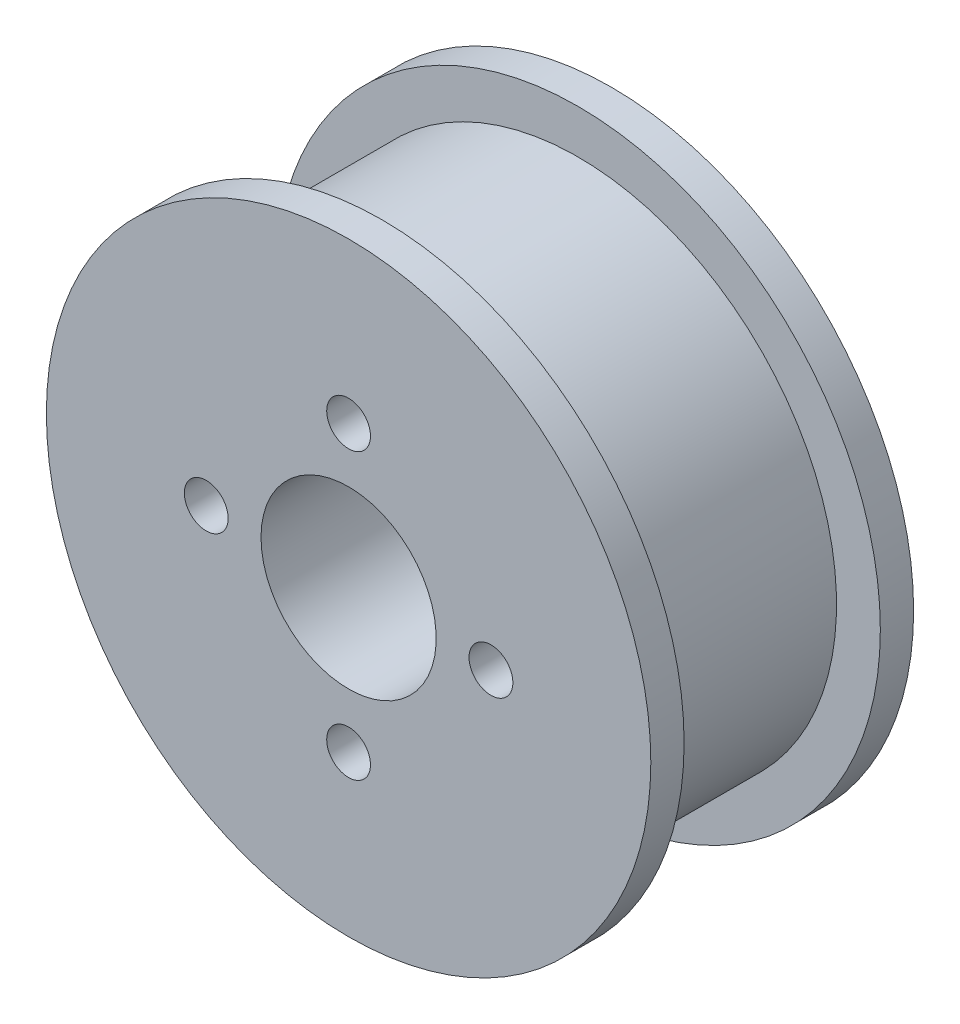
ISO-10303-21;
HEADER;
FILE_DESCRIPTION(('STEP AP214'),'2;1');
FILE_NAME('part.step','',(''),(''),'','','');
FILE_SCHEMA(('AUTOMOTIVE_DESIGN { 1 0 10303 214 1 1 1 1 }'));
ENDSEC;
DATA;
#1=APPLICATION_CONTEXT('core data for automotive mechanical design processes');
#2=APPLICATION_PROTOCOL_DEFINITION('international standard','automotive_design',2000,#1);
#3=PRODUCT_CONTEXT('',#1,'mechanical');
#4=PRODUCT('Part','Part','',(#3));
#5=PRODUCT_RELATED_PRODUCT_CATEGORY('part','',(#4));
#6=PRODUCT_DEFINITION_FORMATION('','',#4);
#7=PRODUCT_DEFINITION_CONTEXT('part definition',#1,'design');
#8=PRODUCT_DEFINITION('design','',#6,#7);
#9=PRODUCT_DEFINITION_SHAPE('','',#8);
#10=(LENGTH_UNIT() NAMED_UNIT(*) SI_UNIT(.MILLI.,.METRE.));
#11=(NAMED_UNIT(*) PLANE_ANGLE_UNIT() SI_UNIT($,.RADIAN.));
#12=(NAMED_UNIT(*) SI_UNIT($,.STERADIAN.) SOLID_ANGLE_UNIT());
#13=UNCERTAINTY_MEASURE_WITH_UNIT(LENGTH_MEASURE(1.E-05),#10,'distance_accuracy_value','');
#14=(GEOMETRIC_REPRESENTATION_CONTEXT(3) GLOBAL_UNCERTAINTY_ASSIGNED_CONTEXT((#13)) GLOBAL_UNIT_ASSIGNED_CONTEXT((#10,
#11,#12)) REPRESENTATION_CONTEXT('',''));
#15=CARTESIAN_POINT('',(0.,0.,0.));
#16=DIRECTION('',(0.,0.,1.));
#17=DIRECTION('',(1.,0.,0.));
#18=AXIS2_PLACEMENT_3D('',#15,#16,#17);
#19=CARTESIAN_POINT('',(0.,0.,1.9));
#20=DIRECTION('',(0.,0.,-1.));
#21=DIRECTION('',(-1.,0.,0.));
#22=AXIS2_PLACEMENT_3D('',#19,#20,#21);
#23=CYLINDRICAL_SURFACE('',#22,17.25);
#24=CARTESIAN_POINT('',(0.,0.,1.9));
#25=DIRECTION('',(0.,0.,1.));
#26=DIRECTION('',(1.,0.,0.));
#27=AXIS2_PLACEMENT_3D('',#24,#25,#26);
#28=CIRCLE('',#27,17.25);
#29=CARTESIAN_POINT('',(-17.25,0.,1.9));
#30=VERTEX_POINT('',#29);
#31=EDGE_CURVE('E43',#30,#30,#28,.T.);
#32=CARTESIAN_POINT('',(0.,0.,0.));
#33=DIRECTION('',(0.,0.,1.));
#34=DIRECTION('',(1.,0.,0.));
#35=AXIS2_PLACEMENT_3D('',#32,#33,#34);
#36=CIRCLE('',#35,17.25);
#37=CARTESIAN_POINT('',(-17.25,0.,0.));
#38=VERTEX_POINT('',#37);
#39=EDGE_CURVE('E39',#38,#38,#36,.T.);
#40=CARTESIAN_POINT('',(-17.25,0.,1.9));
#41=CARTESIAN_POINT('',(-17.25,0.,1.88020833333333));
#42=CARTESIAN_POINT('',(-17.25,0.,1.86041666666667));
#43=CARTESIAN_POINT('',(-17.25,0.,1.82083333333333));
#44=CARTESIAN_POINT('',(-17.25,0.,1.80104166666667));
#45=CARTESIAN_POINT('',(-17.25,0.,1.76145833333333));
#46=CARTESIAN_POINT('',(-17.25,0.,1.74166666666667));
#47=CARTESIAN_POINT('',(-17.25,0.,1.70208333333333));
#48=CARTESIAN_POINT('',(-17.25,0.,1.68229166666667));
#49=CARTESIAN_POINT('',(-17.25,0.,1.64270833333333));
#50=CARTESIAN_POINT('',(-17.25,0.,1.62291666666667));
#51=CARTESIAN_POINT('',(-17.25,0.,1.58333333333333));
#52=CARTESIAN_POINT('',(-17.25,0.,1.56354166666667));
#53=CARTESIAN_POINT('',(-17.25,0.,1.52395833333333));
#54=CARTESIAN_POINT('',(-17.25,0.,1.50416666666667));
#55=CARTESIAN_POINT('',(-17.25,0.,1.46458333333333));
#56=CARTESIAN_POINT('',(-17.25,0.,1.44479166666667));
#57=CARTESIAN_POINT('',(-17.25,0.,1.40520833333333));
#58=CARTESIAN_POINT('',(-17.25,0.,1.38541666666667));
#59=CARTESIAN_POINT('',(-17.25,0.,1.34583333333333));
#60=CARTESIAN_POINT('',(-17.25,0.,1.32604166666667));
#61=CARTESIAN_POINT('',(-17.25,0.,1.28645833333333));
#62=CARTESIAN_POINT('',(-17.25,0.,1.26666666666667));
#63=CARTESIAN_POINT('',(-17.25,0.,1.22708333333333));
#64=CARTESIAN_POINT('',(-17.25,0.,1.20729166666667));
#65=CARTESIAN_POINT('',(-17.25,0.,1.16770833333333));
#66=CARTESIAN_POINT('',(-17.25,0.,1.14791666666667));
#67=CARTESIAN_POINT('',(-17.25,0.,1.10833333333333));
#68=CARTESIAN_POINT('',(-17.25,0.,1.08854166666667));
#69=CARTESIAN_POINT('',(-17.25,0.,1.04895833333333));
#70=CARTESIAN_POINT('',(-17.25,0.,1.02916666666667));
#71=CARTESIAN_POINT('',(-17.25,0.,0.989583333333333));
#72=CARTESIAN_POINT('',(-17.25,0.,0.969791666666666));
#73=CARTESIAN_POINT('',(-17.25,0.,0.930208333333333));
#74=CARTESIAN_POINT('',(-17.25,0.,0.910416666666667));
#75=CARTESIAN_POINT('',(-17.25,0.,0.870833333333333));
#76=CARTESIAN_POINT('',(-17.25,0.,0.851041666666667));
#77=CARTESIAN_POINT('',(-17.25,0.,0.811458333333333));
#78=CARTESIAN_POINT('',(-17.25,0.,0.791666666666667));
#79=CARTESIAN_POINT('',(-17.25,0.,0.752083333333333));
#80=CARTESIAN_POINT('',(-17.25,0.,0.732291666666667));
#81=CARTESIAN_POINT('',(-17.25,0.,0.692708333333333));
#82=CARTESIAN_POINT('',(-17.25,0.,0.672916666666667));
#83=CARTESIAN_POINT('',(-17.25,0.,0.633333333333333));
#84=CARTESIAN_POINT('',(-17.25,0.,0.613541666666667));
#85=CARTESIAN_POINT('',(-17.25,0.,0.573958333333333));
#86=CARTESIAN_POINT('',(-17.25,0.,0.554166666666667));
#87=CARTESIAN_POINT('',(-17.25,0.,0.514583333333334));
#88=CARTESIAN_POINT('',(-17.25,0.,0.494791666666667));
#89=CARTESIAN_POINT('',(-17.25,0.,0.455208333333333));
#90=CARTESIAN_POINT('',(-17.25,0.,0.435416666666667));
#91=CARTESIAN_POINT('',(-17.25,0.,0.395833333333333));
#92=CARTESIAN_POINT('',(-17.25,0.,0.376041666666667));
#93=CARTESIAN_POINT('',(-17.25,0.,0.336458333333333));
#94=CARTESIAN_POINT('',(-17.25,0.,0.316666666666667));
#95=CARTESIAN_POINT('',(-17.25,0.,0.277083333333333));
#96=CARTESIAN_POINT('',(-17.25,0.,0.257291666666667));
#97=CARTESIAN_POINT('',(-17.25,0.,0.217708333333333));
#98=CARTESIAN_POINT('',(-17.25,0.,0.197916666666667));
#99=CARTESIAN_POINT('',(-17.25,0.,0.158333333333333));
#100=CARTESIAN_POINT('',(-17.25,0.,0.138541666666667));
#101=CARTESIAN_POINT('',(-17.25,0.,0.0989583333333333));
#102=CARTESIAN_POINT('',(-17.25,0.,0.0791666666666666));
#103=CARTESIAN_POINT('',(-17.25,0.,0.0395833333333333));
#104=CARTESIAN_POINT('',(-17.25,0.,0.0197916666666666));
#105=CARTESIAN_POINT('',(-17.25,0.,0.));
#106=B_SPLINE_CURVE_WITH_KNOTS('',3,(#40,#41,#42,#43,#44,#45,#46,#47,#48,#49,#50,#51,#52,#53,
#54,#55,#56,#57,#58,#59,#60,#61,#62,#63,#64,#65,#66,#67,#68,#69,#70,#71,#72,#73,#74,#75,#76,#77,
#78,#79,#80,#81,#82,#83,#84,#85,#86,#87,#88,#89,#90,#91,#92,#93,#94,#95,#96,#97,#98,#99,#100,
#101,#102,#103,#104,#105),.UNSPECIFIED.,.F.,.F.,(4,2,2,2,2,2,2,2,2,2,2,2,2,2,2,2,2,2,2,2,2,2,2,
2,2,2,2,2,2,2,2,2,4),(0.,0.0593750000000002,0.11875,0.178125,0.2375,0.296875,0.35625,0.415625,
0.475,0.534375,0.59375,0.653125,0.7125,0.771875,0.83125,0.890625,0.95,1.009375,1.06875,1.128125,
1.1875,1.246875,1.30625,1.365625,1.425,1.484375,1.54375,1.603125,1.6625,1.721875,1.78125,
1.840625,1.9),.UNSPECIFIED.);
#107=EDGE_CURVE('BSEAM36',#30,#38,#106,.T.);
#108=ORIENTED_EDGE('',*,*,#31,.F.);
#109=ORIENTED_EDGE('',*,*,#39,.T.);
#110=ORIENTED_EDGE('',*,*,#107,.T.);
#111=ORIENTED_EDGE('',*,*,#107,.F.);
#112=EDGE_LOOP('',(#108,#110,#109,#111));
#113=FACE_BOUND('',#112,.T.);
#114=ADVANCED_FACE('F36',(#113),#23,.T.);
#115=CARTESIAN_POINT('',(0.,0.,1.9));
#116=DIRECTION('',(0.,0.,1.));
#117=DIRECTION('',(1.,0.,0.));
#118=AXIS2_PLACEMENT_3D('',#115,#116,#117);
#119=PLANE('',#118);
#120=CARTESIAN_POINT('',(0.,8.125,1.9));
#121=DIRECTION('',(0.,0.,-1.));
#122=DIRECTION('',(-1.,0.,0.));
#123=AXIS2_PLACEMENT_3D('',#120,#121,#122);
#124=CIRCLE('',#123,1.25);
#125=CARTESIAN_POINT('',(-1.25,8.125,1.9));
#126=VERTEX_POINT('',#125);
#127=EDGE_CURVE('E62',#126,#126,#124,.T.);
#128=ORIENTED_EDGE('',*,*,#127,.T.);
#129=EDGE_LOOP('',(#128));
#130=FACE_BOUND('',#129,.T.);
#131=CARTESIAN_POINT('',(-8.125,0.,1.9));
#132=DIRECTION('',(0.,0.,-1.));
#133=DIRECTION('',(-1.,0.,0.));
#134=AXIS2_PLACEMENT_3D('',#131,#132,#133);
#135=CIRCLE('',#134,1.25);
#136=CARTESIAN_POINT('',(-9.375,0.,1.9));
#137=VERTEX_POINT('',#136);
#138=EDGE_CURVE('E77',#137,#137,#135,.T.);
#139=ORIENTED_EDGE('',*,*,#138,.T.);
#140=EDGE_LOOP('',(#139));
#141=FACE_BOUND('',#140,.T.);
#142=CARTESIAN_POINT('',(0.,-8.125,1.9));
#143=DIRECTION('',(0.,0.,-1.));
#144=DIRECTION('',(-1.,0.,0.));
#145=AXIS2_PLACEMENT_3D('',#142,#143,#144);
#146=CIRCLE('',#145,1.25);
#147=CARTESIAN_POINT('',(-1.25,-8.125,1.9));
#148=VERTEX_POINT('',#147);
#149=EDGE_CURVE('E71',#148,#148,#146,.T.);
#150=ORIENTED_EDGE('',*,*,#149,.T.);
#151=EDGE_LOOP('',(#150));
#152=FACE_BOUND('',#151,.T.);
#153=CARTESIAN_POINT('',(8.125,0.,1.9));
#154=DIRECTION('',(0.,0.,-1.));
#155=DIRECTION('',(-1.,0.,0.));
#156=AXIS2_PLACEMENT_3D('',#153,#154,#155);
#157=CIRCLE('',#156,1.25);
#158=CARTESIAN_POINT('',(6.875,0.,1.9));
#159=VERTEX_POINT('',#158);
#160=EDGE_CURVE('E65',#159,#159,#157,.T.);
#161=ORIENTED_EDGE('',*,*,#160,.T.);
#162=EDGE_LOOP('',(#161));
#163=FACE_BOUND('',#162,.T.);
#164=CARTESIAN_POINT('',(0.,0.,1.9));
#165=DIRECTION('',(0.,0.,-1.));
#166=DIRECTION('',(-1.,0.,0.));
#167=AXIS2_PLACEMENT_3D('',#164,#165,#166);
#168=CIRCLE('',#167,5.);
#169=CARTESIAN_POINT('',(-5.,0.,1.9));
#170=VERTEX_POINT('',#169);
#171=EDGE_CURVE('E56',#170,#170,#168,.T.);
#172=ORIENTED_EDGE('',*,*,#171,.T.);
#173=EDGE_LOOP('',(#172));
#174=FACE_BOUND('',#173,.T.);
#175=ORIENTED_EDGE('',*,*,#31,.T.);
#176=EDGE_LOOP('',(#175));
#177=FACE_BOUND('',#176,.T.);
#178=ADVANCED_FACE('F89',(#130,#141,#152,#163,#174,#177),#119,.T.);
#179=CARTESIAN_POINT('',(0.,0.,0.));
#180=DIRECTION('',(0.,0.,1.));
#181=DIRECTION('',(1.,0.,0.));
#182=AXIS2_PLACEMENT_3D('',#179,#180,#181);
#183=PLANE('',#182);
#184=CARTESIAN_POINT('',(0.,0.,0.));
#185=DIRECTION('',(0.,0.,-1.));
#186=DIRECTION('',(-1.,0.,0.));
#187=AXIS2_PLACEMENT_3D('',#184,#185,#186);
#188=CIRCLE('',#187,14.75);
#189=CARTESIAN_POINT('',(-14.75,0.,0.));
#190=VERTEX_POINT('',#189);
#191=EDGE_CURVE('E10',#190,#190,#188,.T.);
#192=ORIENTED_EDGE('',*,*,#191,.F.);
#193=EDGE_LOOP('',(#192));
#194=FACE_BOUND('',#193,.T.);
#195=ORIENTED_EDGE('',*,*,#39,.F.);
#196=EDGE_LOOP('',(#195));
#197=FACE_BOUND('',#196,.T.);
#198=ADVANCED_FACE('F137',(#194,#197),#183,.F.);
#199=CARTESIAN_POINT('',(0.,0.,-11.2));
#200=DIRECTION('',(0.,0.,1.));
#201=DIRECTION('',(1.,0.,0.));
#202=AXIS2_PLACEMENT_3D('',#199,#200,#201);
#203=CYLINDRICAL_SURFACE('',#202,14.75);
#204=CARTESIAN_POINT('',(0.,0.,-11.2));
#205=DIRECTION('',(0.,0.,-1.));
#206=DIRECTION('',(-1.,0.,0.));
#207=AXIS2_PLACEMENT_3D('',#204,#205,#206);
#208=CIRCLE('',#207,14.75);
#209=CARTESIAN_POINT('',(-14.75,0.,-11.2));
#210=VERTEX_POINT('',#209);
#211=EDGE_CURVE('E49',#210,#210,#208,.T.);
#212=ORIENTED_EDGE('',*,*,#211,.F.);
#213=EDGE_LOOP('',(#212));
#214=FACE_BOUND('',#213,.T.);
#215=ORIENTED_EDGE('',*,*,#191,.T.);
#216=EDGE_LOOP('',(#215));
#217=FACE_BOUND('',#216,.T.);
#218=ADVANCED_FACE('F117',(#214,#217),#203,.T.);
#219=CARTESIAN_POINT('',(0.,0.,-13.1));
#220=DIRECTION('',(0.,0.,1.));
#221=DIRECTION('',(1.,0.,0.));
#222=AXIS2_PLACEMENT_3D('',#219,#220,#221);
#223=CYLINDRICAL_SURFACE('',#222,17.25);
#224=CARTESIAN_POINT('',(0.,0.,-13.1));
#225=DIRECTION('',(0.,0.,-1.));
#226=DIRECTION('',(-1.,0.,0.));
#227=AXIS2_PLACEMENT_3D('',#224,#225,#226);
#228=CIRCLE('',#227,17.25);
#229=CARTESIAN_POINT('',(17.25,0.,-13.1));
#230=VERTEX_POINT('',#229);
#231=EDGE_CURVE('E52',#230,#230,#228,.T.);
#232=CARTESIAN_POINT('',(0.,0.,-11.2));
#233=DIRECTION('',(0.,0.,-1.));
#234=DIRECTION('',(-1.,0.,0.));
#235=AXIS2_PLACEMENT_3D('',#232,#233,#234);
#236=CIRCLE('',#235,17.25);
#237=CARTESIAN_POINT('',(17.25,0.,-11.2));
#238=VERTEX_POINT('',#237);
#239=EDGE_CURVE('E53',#238,#238,#236,.T.);
#240=CARTESIAN_POINT('',(17.25,0.,-13.1));
#241=CARTESIAN_POINT('',(17.25,0.,-13.0802083333333));
#242=CARTESIAN_POINT('',(17.25,0.,-13.0604166666667));
#243=CARTESIAN_POINT('',(17.25,0.,-13.0208333333333));
#244=CARTESIAN_POINT('',(17.25,0.,-13.0010416666667));
#245=CARTESIAN_POINT('',(17.25,0.,-12.9614583333333));
#246=CARTESIAN_POINT('',(17.25,0.,-12.9416666666667));
#247=CARTESIAN_POINT('',(17.25,0.,-12.9020833333333));
#248=CARTESIAN_POINT('',(17.25,0.,-12.8822916666667));
#249=CARTESIAN_POINT('',(17.25,0.,-12.8427083333333));
#250=CARTESIAN_POINT('',(17.25,0.,-12.8229166666667));
#251=CARTESIAN_POINT('',(17.25,0.,-12.7833333333333));
#252=CARTESIAN_POINT('',(17.25,0.,-12.7635416666667));
#253=CARTESIAN_POINT('',(17.25,0.,-12.7239583333333));
#254=CARTESIAN_POINT('',(17.25,0.,-12.7041666666667));
#255=CARTESIAN_POINT('',(17.25,0.,-12.6645833333333));
#256=CARTESIAN_POINT('',(17.25,0.,-12.6447916666667));
#257=CARTESIAN_POINT('',(17.25,0.,-12.6052083333333));
#258=CARTESIAN_POINT('',(17.25,0.,-12.5854166666667));
#259=CARTESIAN_POINT('',(17.25,0.,-12.5458333333333));
#260=CARTESIAN_POINT('',(17.25,0.,-12.5260416666667));
#261=CARTESIAN_POINT('',(17.25,0.,-12.4864583333333));
#262=CARTESIAN_POINT('',(17.25,0.,-12.4666666666667));
#263=CARTESIAN_POINT('',(17.25,0.,-12.4270833333333));
#264=CARTESIAN_POINT('',(17.25,0.,-12.4072916666667));
#265=CARTESIAN_POINT('',(17.25,0.,-12.3677083333333));
#266=CARTESIAN_POINT('',(17.25,0.,-12.3479166666667));
#267=CARTESIAN_POINT('',(17.25,0.,-12.3083333333333));
#268=CARTESIAN_POINT('',(17.25,0.,-12.2885416666667));
#269=CARTESIAN_POINT('',(17.25,0.,-12.2489583333333));
#270=CARTESIAN_POINT('',(17.25,0.,-12.2291666666667));
#271=CARTESIAN_POINT('',(17.25,0.,-12.1895833333333));
#272=CARTESIAN_POINT('',(17.25,0.,-12.1697916666667));
#273=CARTESIAN_POINT('',(17.25,0.,-12.1302083333333));
#274=CARTESIAN_POINT('',(17.25,0.,-12.1104166666667));
#275=CARTESIAN_POINT('',(17.25,0.,-12.0708333333333));
#276=CARTESIAN_POINT('',(17.25,0.,-12.0510416666667));
#277=CARTESIAN_POINT('',(17.25,0.,-12.0114583333333));
#278=CARTESIAN_POINT('',(17.25,0.,-11.9916666666667));
#279=CARTESIAN_POINT('',(17.25,0.,-11.9520833333333));
#280=CARTESIAN_POINT('',(17.25,0.,-11.9322916666667));
#281=CARTESIAN_POINT('',(17.25,0.,-11.8927083333333));
#282=CARTESIAN_POINT('',(17.25,0.,-11.8729166666667));
#283=CARTESIAN_POINT('',(17.25,0.,-11.8333333333333));
#284=CARTESIAN_POINT('',(17.25,0.,-11.8135416666667));
#285=CARTESIAN_POINT('',(17.25,0.,-11.7739583333333));
#286=CARTESIAN_POINT('',(17.25,0.,-11.7541666666667));
#287=CARTESIAN_POINT('',(17.25,0.,-11.7145833333333));
#288=CARTESIAN_POINT('',(17.25,0.,-11.6947916666667));
#289=CARTESIAN_POINT('',(17.25,0.,-11.6552083333333));
#290=CARTESIAN_POINT('',(17.25,0.,-11.6354166666667));
#291=CARTESIAN_POINT('',(17.25,0.,-11.5958333333333));
#292=CARTESIAN_POINT('',(17.25,0.,-11.5760416666667));
#293=CARTESIAN_POINT('',(17.25,0.,-11.5364583333333));
#294=CARTESIAN_POINT('',(17.25,0.,-11.5166666666667));
#295=CARTESIAN_POINT('',(17.25,0.,-11.4770833333333));
#296=CARTESIAN_POINT('',(17.25,0.,-11.4572916666667));
#297=CARTESIAN_POINT('',(17.25,0.,-11.4177083333333));
#298=CARTESIAN_POINT('',(17.25,0.,-11.3979166666667));
#299=CARTESIAN_POINT('',(17.25,0.,-11.3583333333333));
#300=CARTESIAN_POINT('',(17.25,0.,-11.3385416666667));
#301=CARTESIAN_POINT('',(17.25,0.,-11.2989583333333));
#302=CARTESIAN_POINT('',(17.25,0.,-11.2791666666667));
#303=CARTESIAN_POINT('',(17.25,0.,-11.2395833333333));
#304=CARTESIAN_POINT('',(17.25,0.,-11.2197916666667));
#305=CARTESIAN_POINT('',(17.25,0.,-11.2));
#306=B_SPLINE_CURVE_WITH_KNOTS('',3,(#240,#241,#242,#243,#244,#245,#246,#247,#248,#249,#250,
#251,#252,#253,#254,#255,#256,#257,#258,#259,#260,#261,#262,#263,#264,#265,#266,#267,#268,#269,
#270,#271,#272,#273,#274,#275,#276,#277,#278,#279,#280,#281,#282,#283,#284,#285,#286,#287,#288,
#289,#290,#291,#292,#293,#294,#295,#296,#297,#298,#299,#300,#301,#302,#303,#304,#305),
.UNSPECIFIED.,.F.,.F.,(4,2,2,2,2,2,2,2,2,2,2,2,2,2,2,2,2,2,2,2,2,2,2,2,2,2,2,2,2,2,2,2,4),(0.,
0.0593749999999987,0.118749999999999,0.178124999999999,0.2375,0.296874999999999,
0.356249999999999,0.415624999999999,0.475,0.534374999999998,0.593749999999999,0.653124999999999,
0.7125,0.771875,0.831249999999999,0.890624999999999,0.95,1.009375,1.06875,1.128125,1.1875,
1.246875,1.30625,1.365625,1.425,1.484375,1.54375,1.603125,1.6625,1.721875,1.78125,1.840625,1.9),.UNSPECIFIED.);
#307=EDGE_CURVE('BSEAM103',#230,#238,#306,.T.);
#308=ORIENTED_EDGE('',*,*,#231,.F.);
#309=ORIENTED_EDGE('',*,*,#239,.T.);
#310=ORIENTED_EDGE('',*,*,#307,.T.);
#311=ORIENTED_EDGE('',*,*,#307,.F.);
#312=EDGE_LOOP('',(#308,#310,#309,#311));
#313=FACE_BOUND('',#312,.T.);
#314=ADVANCED_FACE('F103',(#313),#223,.T.);
#315=CARTESIAN_POINT('',(0.,0.,-13.1));
#316=DIRECTION('',(0.,0.,-1.));
#317=DIRECTION('',(-1.,0.,0.));
#318=AXIS2_PLACEMENT_3D('',#315,#316,#317);
#319=PLANE('',#318);
#320=CARTESIAN_POINT('',(0.,8.125,-13.1));
#321=DIRECTION('',(0.,0.,-1.));
#322=DIRECTION('',(-1.,0.,0.));
#323=AXIS2_PLACEMENT_3D('',#320,#321,#322);
#324=CIRCLE('',#323,1.25);
#325=CARTESIAN_POINT('',(-1.25,8.125,-13.1));
#326=VERTEX_POINT('',#325);
#327=EDGE_CURVE('E83',#326,#326,#324,.T.);
#328=ORIENTED_EDGE('',*,*,#327,.F.);
#329=EDGE_LOOP('',(#328));
#330=FACE_BOUND('',#329,.T.);
#331=CARTESIAN_POINT('',(-8.125,0.,-13.1));
#332=DIRECTION('',(0.,0.,-1.));
#333=DIRECTION('',(-1.,0.,0.));
#334=AXIS2_PLACEMENT_3D('',#331,#332,#333);
#335=CIRCLE('',#334,1.25);
#336=CARTESIAN_POINT('',(-9.375,0.,-13.1));
#337=VERTEX_POINT('',#336);
#338=EDGE_CURVE('E80',#337,#337,#335,.T.);
#339=ORIENTED_EDGE('',*,*,#338,.F.);
#340=EDGE_LOOP('',(#339));
#341=FACE_BOUND('',#340,.T.);
#342=CARTESIAN_POINT('',(0.,-8.125,-13.1));
#343=DIRECTION('',(0.,0.,-1.));
#344=DIRECTION('',(-1.,0.,0.));
#345=AXIS2_PLACEMENT_3D('',#342,#343,#344);
#346=CIRCLE('',#345,1.25);
#347=CARTESIAN_POINT('',(-1.25,-8.125,-13.1));
#348=VERTEX_POINT('',#347);
#349=EDGE_CURVE('E74',#348,#348,#346,.T.);
#350=ORIENTED_EDGE('',*,*,#349,.F.);
#351=EDGE_LOOP('',(#350));
#352=FACE_BOUND('',#351,.T.);
#353=CARTESIAN_POINT('',(8.125,0.,-13.1));
#354=DIRECTION('',(0.,0.,-1.));
#355=DIRECTION('',(-1.,0.,0.));
#356=AXIS2_PLACEMENT_3D('',#353,#354,#355);
#357=CIRCLE('',#356,1.25);
#358=CARTESIAN_POINT('',(6.875,0.,-13.1));
#359=VERTEX_POINT('',#358);
#360=EDGE_CURVE('E68',#359,#359,#357,.T.);
#361=ORIENTED_EDGE('',*,*,#360,.F.);
#362=EDGE_LOOP('',(#361));
#363=FACE_BOUND('',#362,.T.);
#364=CARTESIAN_POINT('',(0.,0.,-13.1));
#365=DIRECTION('',(0.,0.,-1.));
#366=DIRECTION('',(-1.,0.,0.));
#367=AXIS2_PLACEMENT_3D('',#364,#365,#366);
#368=CIRCLE('',#367,5.);
#369=CARTESIAN_POINT('',(-5.,0.,-13.1));
#370=VERTEX_POINT('',#369);
#371=EDGE_CURVE('E59',#370,#370,#368,.T.);
#372=ORIENTED_EDGE('',*,*,#371,.F.);
#373=EDGE_LOOP('',(#372));
#374=FACE_BOUND('',#373,.T.);
#375=ORIENTED_EDGE('',*,*,#231,.T.);
#376=EDGE_LOOP('',(#375));
#377=FACE_BOUND('',#376,.T.);
#378=ADVANCED_FACE('F99',(#330,#341,#352,#363,#374,#377),#319,.T.);
#379=CARTESIAN_POINT('',(0.,0.,-11.2));
#380=DIRECTION('',(0.,0.,-1.));
#381=DIRECTION('',(-1.,0.,0.));
#382=AXIS2_PLACEMENT_3D('',#379,#380,#381);
#383=PLANE('',#382);
#384=ORIENTED_EDGE('',*,*,#211,.T.);
#385=EDGE_LOOP('',(#384));
#386=FACE_BOUND('',#385,.T.);
#387=ORIENTED_EDGE('',*,*,#239,.F.);
#388=EDGE_LOOP('',(#387));
#389=FACE_BOUND('',#388,.T.);
#390=ADVANCED_FACE('F102',(#386,#389),#383,.F.);
#391=CARTESIAN_POINT('',(0.,0.,1.9));
#392=DIRECTION('',(0.,0.,-1.));
#393=DIRECTION('',(-1.,0.,0.));
#394=AXIS2_PLACEMENT_3D('',#391,#392,#393);
#395=CYLINDRICAL_SURFACE('',#394,5.);
#396=CARTESIAN_POINT('',(-5.,0.,1.9));
#397=CARTESIAN_POINT('',(-5.,0.,1.74375));
#398=CARTESIAN_POINT('',(-5.,0.,1.5875));
#399=CARTESIAN_POINT('',(-5.,0.,1.275));
#400=CARTESIAN_POINT('',(-5.,0.,1.11875));
#401=CARTESIAN_POINT('',(-5.,0.,0.806250000000001));
#402=CARTESIAN_POINT('',(-5.,0.,0.65));
#403=CARTESIAN_POINT('',(-5.,0.,0.3375));
#404=CARTESIAN_POINT('',(-5.,0.,0.18125));
#405=CARTESIAN_POINT('',(-5.,0.,-0.131249999999999));
#406=CARTESIAN_POINT('',(-5.,0.,-0.287499999999999));
#407=CARTESIAN_POINT('',(-5.,0.,-0.599999999999999));
#408=CARTESIAN_POINT('',(-5.,0.,-0.75625));
#409=CARTESIAN_POINT('',(-5.,0.,-1.06875));
#410=CARTESIAN_POINT('',(-5.,0.,-1.225));
#411=CARTESIAN_POINT('',(-5.,0.,-1.5375));
#412=CARTESIAN_POINT('',(-5.,0.,-1.69375));
#413=CARTESIAN_POINT('',(-5.,0.,-2.00625));
#414=CARTESIAN_POINT('',(-5.,0.,-2.1625));
#415=CARTESIAN_POINT('',(-5.,0.,-2.475));
#416=CARTESIAN_POINT('',(-5.,0.,-2.63125));
#417=CARTESIAN_POINT('',(-5.,0.,-2.94375));
#418=CARTESIAN_POINT('',(-5.,0.,-3.1));
#419=CARTESIAN_POINT('',(-5.,0.,-3.4125));
#420=CARTESIAN_POINT('',(-5.,0.,-3.56875));
#421=CARTESIAN_POINT('',(-5.,0.,-3.88125));
#422=CARTESIAN_POINT('',(-5.,0.,-4.0375));
#423=CARTESIAN_POINT('',(-5.,0.,-4.35));
#424=CARTESIAN_POINT('',(-5.,0.,-4.50625));
#425=CARTESIAN_POINT('',(-5.,0.,-4.81875));
#426=CARTESIAN_POINT('',(-5.,0.,-4.975));
#427=CARTESIAN_POINT('',(-5.,0.,-5.2875));
#428=CARTESIAN_POINT('',(-5.,0.,-5.44375));
#429=CARTESIAN_POINT('',(-5.,0.,-5.75625));
#430=CARTESIAN_POINT('',(-5.,0.,-5.9125));
#431=CARTESIAN_POINT('',(-5.,0.,-6.225));
#432=CARTESIAN_POINT('',(-5.,0.,-6.38125));
#433=CARTESIAN_POINT('',(-5.,0.,-6.69375));
#434=CARTESIAN_POINT('',(-5.,0.,-6.85));
#435=CARTESIAN_POINT('',(-5.,0.,-7.1625));
#436=CARTESIAN_POINT('',(-5.,0.,-7.31875));
#437=CARTESIAN_POINT('',(-5.,0.,-7.63125));
#438=CARTESIAN_POINT('',(-5.,0.,-7.7875));
#439=CARTESIAN_POINT('',(-5.,0.,-8.1));
#440=CARTESIAN_POINT('',(-5.,0.,-8.25625));
#441=CARTESIAN_POINT('',(-5.,0.,-8.56875));
#442=CARTESIAN_POINT('',(-5.,0.,-8.725));
#443=CARTESIAN_POINT('',(-5.,0.,-9.0375));
#444=CARTESIAN_POINT('',(-5.,0.,-9.19375));
#445=CARTESIAN_POINT('',(-5.,0.,-9.50625));
#446=CARTESIAN_POINT('',(-5.,0.,-9.6625));
#447=CARTESIAN_POINT('',(-5.,0.,-9.975));
#448=CARTESIAN_POINT('',(-5.,0.,-10.13125));
#449=CARTESIAN_POINT('',(-5.,0.,-10.44375));
#450=CARTESIAN_POINT('',(-5.,0.,-10.6));
#451=CARTESIAN_POINT('',(-5.,0.,-10.9125));
#452=CARTESIAN_POINT('',(-5.,0.,-11.06875));
#453=CARTESIAN_POINT('',(-5.,0.,-11.38125));
#454=CARTESIAN_POINT('',(-5.,0.,-11.5375));
#455=CARTESIAN_POINT('',(-5.,0.,-11.85));
#456=CARTESIAN_POINT('',(-5.,0.,-12.00625));
#457=CARTESIAN_POINT('',(-5.,0.,-12.31875));
#458=CARTESIAN_POINT('',(-5.,0.,-12.475));
#459=CARTESIAN_POINT('',(-5.,0.,-12.7875));
#460=CARTESIAN_POINT('',(-5.,0.,-12.94375));
#461=CARTESIAN_POINT('',(-5.,0.,-13.1));
#462=B_SPLINE_CURVE_WITH_KNOTS('',3,(#396,#397,#398,#399,#400,#401,#402,#403,#404,#405,#406,
#407,#408,#409,#410,#411,#412,#413,#414,#415,#416,#417,#418,#419,#420,#421,#422,#423,#424,#425,
#426,#427,#428,#429,#430,#431,#432,#433,#434,#435,#436,#437,#438,#439,#440,#441,#442,#443,#444,
#445,#446,#447,#448,#449,#450,#451,#452,#453,#454,#455,#456,#457,#458,#459,#460,#461),
.UNSPECIFIED.,.F.,.F.,(4,2,2,2,2,2,2,2,2,2,2,2,2,2,2,2,2,2,2,2,2,2,2,2,2,2,2,2,2,2,2,2,4),(0.,
0.46875,0.9375,1.40625,1.875,2.34375,2.8125,3.28125,3.75,4.21875,4.6875,5.15625,5.625,6.09375,
6.5625,7.03125,7.5,7.96875,8.4375,8.90625,9.375,9.84375,10.3125,10.78125,11.25,11.71875,12.1875,
12.65625,13.125,13.59375,14.0625,14.53125,15.),.UNSPECIFIED.);
#463=EDGE_CURVE('BSEAM122',#170,#370,#462,.T.);
#464=ORIENTED_EDGE('',*,*,#171,.F.);
#465=ORIENTED_EDGE('',*,*,#371,.T.);
#466=ORIENTED_EDGE('',*,*,#463,.T.);
#467=ORIENTED_EDGE('',*,*,#463,.F.);
#468=EDGE_LOOP('',(#464,#466,#465,#467));
#469=FACE_BOUND('',#468,.T.);
#470=ADVANCED_FACE('F122',(#469),#395,.F.);
#471=CARTESIAN_POINT('',(8.125,0.,1.9));
#472=DIRECTION('',(0.,0.,-1.));
#473=DIRECTION('',(-1.,0.,0.));
#474=AXIS2_PLACEMENT_3D('',#471,#472,#473);
#475=CYLINDRICAL_SURFACE('',#474,1.25);
#476=CARTESIAN_POINT('',(6.875,0.,1.9));
#477=CARTESIAN_POINT('',(6.875,0.,1.74375));
#478=CARTESIAN_POINT('',(6.875,0.,1.5875));
#479=CARTESIAN_POINT('',(6.875,0.,1.275));
#480=CARTESIAN_POINT('',(6.875,0.,1.11875));
#481=CARTESIAN_POINT('',(6.875,0.,0.806250000000001));
#482=CARTESIAN_POINT('',(6.875,0.,0.650000000000001));
#483=CARTESIAN_POINT('',(6.875,0.,0.337500000000001));
#484=CARTESIAN_POINT('',(6.875,0.,0.181250000000001));
#485=CARTESIAN_POINT('',(6.875,0.,-0.131249999999999));
#486=CARTESIAN_POINT('',(6.875,0.,-0.287499999999999));
#487=CARTESIAN_POINT('',(6.875,0.,-0.599999999999999));
#488=CARTESIAN_POINT('',(6.875,0.,-0.75625));
#489=CARTESIAN_POINT('',(6.875,0.,-1.06875));
#490=CARTESIAN_POINT('',(6.875,0.,-1.225));
#491=CARTESIAN_POINT('',(6.875,0.,-1.5375));
#492=CARTESIAN_POINT('',(6.875,0.,-1.69375));
#493=CARTESIAN_POINT('',(6.875,0.,-2.00625));
#494=CARTESIAN_POINT('',(6.875,0.,-2.1625));
#495=CARTESIAN_POINT('',(6.875,0.,-2.475));
#496=CARTESIAN_POINT('',(6.875,0.,-2.63125));
#497=CARTESIAN_POINT('',(6.875,0.,-2.94375));
#498=CARTESIAN_POINT('',(6.875,0.,-3.1));
#499=CARTESIAN_POINT('',(6.875,0.,-3.4125));
#500=CARTESIAN_POINT('',(6.875,0.,-3.56875));
#501=CARTESIAN_POINT('',(6.875,0.,-3.88125));
#502=CARTESIAN_POINT('',(6.875,0.,-4.0375));
#503=CARTESIAN_POINT('',(6.875,0.,-4.35));
#504=CARTESIAN_POINT('',(6.875,0.,-4.50625));
#505=CARTESIAN_POINT('',(6.875,0.,-4.81875));
#506=CARTESIAN_POINT('',(6.875,0.,-4.975));
#507=CARTESIAN_POINT('',(6.875,0.,-5.2875));
#508=CARTESIAN_POINT('',(6.875,0.,-5.44375));
#509=CARTESIAN_POINT('',(6.875,0.,-5.75625));
#510=CARTESIAN_POINT('',(6.875,0.,-5.9125));
#511=CARTESIAN_POINT('',(6.875,0.,-6.225));
#512=CARTESIAN_POINT('',(6.875,0.,-6.38125));
#513=CARTESIAN_POINT('',(6.875,0.,-6.69375));
#514=CARTESIAN_POINT('',(6.875,0.,-6.85));
#515=CARTESIAN_POINT('',(6.875,0.,-7.1625));
#516=CARTESIAN_POINT('',(6.875,0.,-7.31875));
#517=CARTESIAN_POINT('',(6.875,0.,-7.63125));
#518=CARTESIAN_POINT('',(6.875,0.,-7.7875));
#519=CARTESIAN_POINT('',(6.875,0.,-8.1));
#520=CARTESIAN_POINT('',(6.875,0.,-8.25625));
#521=CARTESIAN_POINT('',(6.875,0.,-8.56875));
#522=CARTESIAN_POINT('',(6.875,0.,-8.725));
#523=CARTESIAN_POINT('',(6.875,0.,-9.0375));
#524=CARTESIAN_POINT('',(6.875,0.,-9.19375));
#525=CARTESIAN_POINT('',(6.875,0.,-9.50625));
#526=CARTESIAN_POINT('',(6.875,0.,-9.6625));
#527=CARTESIAN_POINT('',(6.875,0.,-9.975));
#528=CARTESIAN_POINT('',(6.875,0.,-10.13125));
#529=CARTESIAN_POINT('',(6.875,0.,-10.44375));
#530=CARTESIAN_POINT('',(6.875,0.,-10.6));
#531=CARTESIAN_POINT('',(6.875,0.,-10.9125));
#532=CARTESIAN_POINT('',(6.875,0.,-11.06875));
#533=CARTESIAN_POINT('',(6.875,0.,-11.38125));
#534=CARTESIAN_POINT('',(6.875,0.,-11.5375));
#535=CARTESIAN_POINT('',(6.875,0.,-11.85));
#536=CARTESIAN_POINT('',(6.875,0.,-12.00625));
#537=CARTESIAN_POINT('',(6.875,0.,-12.31875));
#538=CARTESIAN_POINT('',(6.875,0.,-12.475));
#539=CARTESIAN_POINT('',(6.875,0.,-12.7875));
#540=CARTESIAN_POINT('',(6.875,0.,-12.94375));
#541=CARTESIAN_POINT('',(6.875,0.,-13.1));
#542=B_SPLINE_CURVE_WITH_KNOTS('',3,(#476,#477,#478,#479,#480,#481,#482,#483,#484,#485,#486,
#487,#488,#489,#490,#491,#492,#493,#494,#495,#496,#497,#498,#499,#500,#501,#502,#503,#504,#505,
#506,#507,#508,#509,#510,#511,#512,#513,#514,#515,#516,#517,#518,#519,#520,#521,#522,#523,#524,
#525,#526,#527,#528,#529,#530,#531,#532,#533,#534,#535,#536,#537,#538,#539,#540,#541),
.UNSPECIFIED.,.F.,.F.,(4,2,2,2,2,2,2,2,2,2,2,2,2,2,2,2,2,2,2,2,2,2,2,2,2,2,2,2,2,2,2,2,4),(0.,
0.46875,0.9375,1.40625,1.875,2.34375,2.8125,3.28125,3.75,4.21875,4.6875,5.15625,5.625,6.09375,
6.5625,7.03125,7.5,7.96875,8.4375,8.90625,9.375,9.84375,10.3125,10.78125,11.25,11.71875,12.1875,
12.65625,13.125,13.59375,14.0625,14.53125,15.),.UNSPECIFIED.);
#543=EDGE_CURVE('BSEAM128',#159,#359,#542,.T.);
#544=ORIENTED_EDGE('',*,*,#160,.F.);
#545=ORIENTED_EDGE('',*,*,#360,.T.);
#546=ORIENTED_EDGE('',*,*,#543,.T.);
#547=ORIENTED_EDGE('',*,*,#543,.F.);
#548=EDGE_LOOP('',(#544,#546,#545,#547));
#549=FACE_BOUND('',#548,.T.);
#550=ADVANCED_FACE('F128',(#549),#475,.F.);
#551=CARTESIAN_POINT('',(0.,-8.125,1.9));
#552=DIRECTION('',(0.,0.,-1.));
#553=DIRECTION('',(-1.,0.,0.));
#554=AXIS2_PLACEMENT_3D('',#551,#552,#553);
#555=CYLINDRICAL_SURFACE('',#554,1.25);
#556=CARTESIAN_POINT('',(-1.25,-8.125,1.9));
#557=CARTESIAN_POINT('',(-1.25,-8.125,1.74375));
#558=CARTESIAN_POINT('',(-1.25,-8.125,1.5875));
#559=CARTESIAN_POINT('',(-1.25,-8.125,1.275));
#560=CARTESIAN_POINT('',(-1.25,-8.125,1.11875));
#561=CARTESIAN_POINT('',(-1.25,-8.125,0.806250000000001));
#562=CARTESIAN_POINT('',(-1.25,-8.125,0.650000000000001));
#563=CARTESIAN_POINT('',(-1.25,-8.125,0.337500000000001));
#564=CARTESIAN_POINT('',(-1.25,-8.125,0.181250000000001));
#565=CARTESIAN_POINT('',(-1.25,-8.125,-0.131249999999999));
#566=CARTESIAN_POINT('',(-1.25,-8.125,-0.287499999999999));
#567=CARTESIAN_POINT('',(-1.25,-8.125,-0.599999999999999));
#568=CARTESIAN_POINT('',(-1.25,-8.125,-0.75625));
#569=CARTESIAN_POINT('',(-1.25,-8.125,-1.06875));
#570=CARTESIAN_POINT('',(-1.25,-8.125,-1.225));
#571=CARTESIAN_POINT('',(-1.25,-8.125,-1.5375));
#572=CARTESIAN_POINT('',(-1.25,-8.125,-1.69375));
#573=CARTESIAN_POINT('',(-1.25,-8.125,-2.00625));
#574=CARTESIAN_POINT('',(-1.25,-8.125,-2.1625));
#575=CARTESIAN_POINT('',(-1.25,-8.125,-2.475));
#576=CARTESIAN_POINT('',(-1.25,-8.125,-2.63125));
#577=CARTESIAN_POINT('',(-1.25,-8.125,-2.94375));
#578=CARTESIAN_POINT('',(-1.25,-8.125,-3.1));
#579=CARTESIAN_POINT('',(-1.25,-8.125,-3.4125));
#580=CARTESIAN_POINT('',(-1.25,-8.125,-3.56875));
#581=CARTESIAN_POINT('',(-1.25,-8.125,-3.88125));
#582=CARTESIAN_POINT('',(-1.25,-8.125,-4.0375));
#583=CARTESIAN_POINT('',(-1.25,-8.125,-4.35));
#584=CARTESIAN_POINT('',(-1.25,-8.125,-4.50625));
#585=CARTESIAN_POINT('',(-1.25,-8.125,-4.81875));
#586=CARTESIAN_POINT('',(-1.25,-8.125,-4.975));
#587=CARTESIAN_POINT('',(-1.25,-8.125,-5.2875));
#588=CARTESIAN_POINT('',(-1.25,-8.125,-5.44375));
#589=CARTESIAN_POINT('',(-1.25,-8.125,-5.75625));
#590=CARTESIAN_POINT('',(-1.25,-8.125,-5.9125));
#591=CARTESIAN_POINT('',(-1.25,-8.125,-6.225));
#592=CARTESIAN_POINT('',(-1.25,-8.125,-6.38125));
#593=CARTESIAN_POINT('',(-1.25,-8.125,-6.69375));
#594=CARTESIAN_POINT('',(-1.25,-8.125,-6.85));
#595=CARTESIAN_POINT('',(-1.25,-8.125,-7.1625));
#596=CARTESIAN_POINT('',(-1.25,-8.125,-7.31875));
#597=CARTESIAN_POINT('',(-1.25,-8.125,-7.63125));
#598=CARTESIAN_POINT('',(-1.25,-8.125,-7.7875));
#599=CARTESIAN_POINT('',(-1.25,-8.125,-8.1));
#600=CARTESIAN_POINT('',(-1.25,-8.125,-8.25625));
#601=CARTESIAN_POINT('',(-1.25,-8.125,-8.56875));
#602=CARTESIAN_POINT('',(-1.25,-8.125,-8.725));
#603=CARTESIAN_POINT('',(-1.25,-8.125,-9.0375));
#604=CARTESIAN_POINT('',(-1.25,-8.125,-9.19375));
#605=CARTESIAN_POINT('',(-1.25,-8.125,-9.50625));
#606=CARTESIAN_POINT('',(-1.25,-8.125,-9.6625));
#607=CARTESIAN_POINT('',(-1.25,-8.125,-9.975));
#608=CARTESIAN_POINT('',(-1.25,-8.125,-10.13125));
#609=CARTESIAN_POINT('',(-1.25,-8.125,-10.44375));
#610=CARTESIAN_POINT('',(-1.25,-8.125,-10.6));
#611=CARTESIAN_POINT('',(-1.25,-8.125,-10.9125));
#612=CARTESIAN_POINT('',(-1.25,-8.125,-11.06875));
#613=CARTESIAN_POINT('',(-1.25,-8.125,-11.38125));
#614=CARTESIAN_POINT('',(-1.25,-8.125,-11.5375));
#615=CARTESIAN_POINT('',(-1.25,-8.125,-11.85));
#616=CARTESIAN_POINT('',(-1.25,-8.125,-12.00625));
#617=CARTESIAN_POINT('',(-1.25,-8.125,-12.31875));
#618=CARTESIAN_POINT('',(-1.25,-8.125,-12.475));
#619=CARTESIAN_POINT('',(-1.25,-8.125,-12.7875));
#620=CARTESIAN_POINT('',(-1.25,-8.125,-12.94375));
#621=CARTESIAN_POINT('',(-1.25,-8.125,-13.1));
#622=B_SPLINE_CURVE_WITH_KNOTS('',3,(#556,#557,#558,#559,#560,#561,#562,#563,#564,#565,#566,
#567,#568,#569,#570,#571,#572,#573,#574,#575,#576,#577,#578,#579,#580,#581,#582,#583,#584,#585,
#586,#587,#588,#589,#590,#591,#592,#593,#594,#595,#596,#597,#598,#599,#600,#601,#602,#603,#604,
#605,#606,#607,#608,#609,#610,#611,#612,#613,#614,#615,#616,#617,#618,#619,#620,#621),
.UNSPECIFIED.,.F.,.F.,(4,2,2,2,2,2,2,2,2,2,2,2,2,2,2,2,2,2,2,2,2,2,2,2,2,2,2,2,2,2,2,2,4),(0.,
0.46875,0.9375,1.40625,1.875,2.34375,2.8125,3.28125,3.75,4.21875,4.6875,5.15625,5.625,6.09375,
6.5625,7.03125,7.5,7.96875,8.4375,8.90625,9.375,9.84375,10.3125,10.78125,11.25,11.71875,12.1875,
12.65625,13.125,13.59375,14.0625,14.53125,15.),.UNSPECIFIED.);
#623=EDGE_CURVE('BSEAM184',#148,#348,#622,.T.);
#624=ORIENTED_EDGE('',*,*,#149,.F.);
#625=ORIENTED_EDGE('',*,*,#349,.T.);
#626=ORIENTED_EDGE('',*,*,#623,.T.);
#627=ORIENTED_EDGE('',*,*,#623,.F.);
#628=EDGE_LOOP('',(#624,#626,#625,#627));
#629=FACE_BOUND('',#628,.T.);
#630=ADVANCED_FACE('F184',(#629),#555,.F.);
#631=CARTESIAN_POINT('',(-8.125,0.,1.9));
#632=DIRECTION('',(0.,0.,-1.));
#633=DIRECTION('',(-1.,0.,0.));
#634=AXIS2_PLACEMENT_3D('',#631,#632,#633);
#635=CYLINDRICAL_SURFACE('',#634,1.25);
#636=CARTESIAN_POINT('',(-9.375,0.,1.9));
#637=CARTESIAN_POINT('',(-9.375,0.,1.74375));
#638=CARTESIAN_POINT('',(-9.375,0.,1.5875));
#639=CARTESIAN_POINT('',(-9.375,0.,1.275));
#640=CARTESIAN_POINT('',(-9.375,0.,1.11875));
#641=CARTESIAN_POINT('',(-9.375,0.,0.806250000000001));
#642=CARTESIAN_POINT('',(-9.375,0.,0.650000000000001));
#643=CARTESIAN_POINT('',(-9.375,0.,0.337500000000001));
#644=CARTESIAN_POINT('',(-9.375,0.,0.181250000000001));
#645=CARTESIAN_POINT('',(-9.375,0.,-0.131249999999999));
#646=CARTESIAN_POINT('',(-9.375,0.,-0.287499999999999));
#647=CARTESIAN_POINT('',(-9.375,0.,-0.599999999999999));
#648=CARTESIAN_POINT('',(-9.375,0.,-0.75625));
#649=CARTESIAN_POINT('',(-9.375,0.,-1.06875));
#650=CARTESIAN_POINT('',(-9.375,0.,-1.225));
#651=CARTESIAN_POINT('',(-9.375,0.,-1.5375));
#652=CARTESIAN_POINT('',(-9.375,0.,-1.69375));
#653=CARTESIAN_POINT('',(-9.375,0.,-2.00625));
#654=CARTESIAN_POINT('',(-9.375,0.,-2.1625));
#655=CARTESIAN_POINT('',(-9.375,0.,-2.475));
#656=CARTESIAN_POINT('',(-9.375,0.,-2.63125));
#657=CARTESIAN_POINT('',(-9.375,0.,-2.94375));
#658=CARTESIAN_POINT('',(-9.375,0.,-3.1));
#659=CARTESIAN_POINT('',(-9.375,0.,-3.4125));
#660=CARTESIAN_POINT('',(-9.375,0.,-3.56875));
#661=CARTESIAN_POINT('',(-9.375,0.,-3.88125));
#662=CARTESIAN_POINT('',(-9.375,0.,-4.0375));
#663=CARTESIAN_POINT('',(-9.375,0.,-4.35));
#664=CARTESIAN_POINT('',(-9.375,0.,-4.50625));
#665=CARTESIAN_POINT('',(-9.375,0.,-4.81875));
#666=CARTESIAN_POINT('',(-9.375,0.,-4.975));
#667=CARTESIAN_POINT('',(-9.375,0.,-5.2875));
#668=CARTESIAN_POINT('',(-9.375,0.,-5.44375));
#669=CARTESIAN_POINT('',(-9.375,0.,-5.75625));
#670=CARTESIAN_POINT('',(-9.375,0.,-5.9125));
#671=CARTESIAN_POINT('',(-9.375,0.,-6.225));
#672=CARTESIAN_POINT('',(-9.375,0.,-6.38125));
#673=CARTESIAN_POINT('',(-9.375,0.,-6.69375));
#674=CARTESIAN_POINT('',(-9.375,0.,-6.85));
#675=CARTESIAN_POINT('',(-9.375,0.,-7.1625));
#676=CARTESIAN_POINT('',(-9.375,0.,-7.31875));
#677=CARTESIAN_POINT('',(-9.375,0.,-7.63125));
#678=CARTESIAN_POINT('',(-9.375,0.,-7.7875));
#679=CARTESIAN_POINT('',(-9.375,0.,-8.1));
#680=CARTESIAN_POINT('',(-9.375,0.,-8.25625));
#681=CARTESIAN_POINT('',(-9.375,0.,-8.56875));
#682=CARTESIAN_POINT('',(-9.375,0.,-8.725));
#683=CARTESIAN_POINT('',(-9.375,0.,-9.0375));
#684=CARTESIAN_POINT('',(-9.375,0.,-9.19375));
#685=CARTESIAN_POINT('',(-9.375,0.,-9.50625));
#686=CARTESIAN_POINT('',(-9.375,0.,-9.6625));
#687=CARTESIAN_POINT('',(-9.375,0.,-9.975));
#688=CARTESIAN_POINT('',(-9.375,0.,-10.13125));
#689=CARTESIAN_POINT('',(-9.375,0.,-10.44375));
#690=CARTESIAN_POINT('',(-9.375,0.,-10.6));
#691=CARTESIAN_POINT('',(-9.375,0.,-10.9125));
#692=CARTESIAN_POINT('',(-9.375,0.,-11.06875));
#693=CARTESIAN_POINT('',(-9.375,0.,-11.38125));
#694=CARTESIAN_POINT('',(-9.375,0.,-11.5375));
#695=CARTESIAN_POINT('',(-9.375,0.,-11.85));
#696=CARTESIAN_POINT('',(-9.375,0.,-12.00625));
#697=CARTESIAN_POINT('',(-9.375,0.,-12.31875));
#698=CARTESIAN_POINT('',(-9.375,0.,-12.475));
#699=CARTESIAN_POINT('',(-9.375,0.,-12.7875));
#700=CARTESIAN_POINT('',(-9.375,0.,-12.94375));
#701=CARTESIAN_POINT('',(-9.375,0.,-13.1));
#702=B_SPLINE_CURVE_WITH_KNOTS('',3,(#636,#637,#638,#639,#640,#641,#642,#643,#644,#645,#646,
#647,#648,#649,#650,#651,#652,#653,#654,#655,#656,#657,#658,#659,#660,#661,#662,#663,#664,#665,
#666,#667,#668,#669,#670,#671,#672,#673,#674,#675,#676,#677,#678,#679,#680,#681,#682,#683,#684,
#685,#686,#687,#688,#689,#690,#691,#692,#693,#694,#695,#696,#697,#698,#699,#700,#701),
.UNSPECIFIED.,.F.,.F.,(4,2,2,2,2,2,2,2,2,2,2,2,2,2,2,2,2,2,2,2,2,2,2,2,2,2,2,2,2,2,2,2,4),(0.,
0.46875,0.9375,1.40625,1.875,2.34375,2.8125,3.28125,3.75,4.21875,4.6875,5.15625,5.625,6.09375,
6.5625,7.03125,7.5,7.96875,8.4375,8.90625,9.375,9.84375,10.3125,10.78125,11.25,11.71875,12.1875,
12.65625,13.125,13.59375,14.0625,14.53125,15.),.UNSPECIFIED.);
#703=EDGE_CURVE('BSEAM95',#137,#337,#702,.T.);
#704=ORIENTED_EDGE('',*,*,#138,.F.);
#705=ORIENTED_EDGE('',*,*,#338,.T.);
#706=ORIENTED_EDGE('',*,*,#703,.T.);
#707=ORIENTED_EDGE('',*,*,#703,.F.);
#708=EDGE_LOOP('',(#704,#706,#705,#707));
#709=FACE_BOUND('',#708,.T.);
#710=ADVANCED_FACE('F95',(#709),#635,.F.);
#711=CARTESIAN_POINT('',(0.,8.125,1.9));
#712=DIRECTION('',(0.,0.,-1.));
#713=DIRECTION('',(-1.,0.,0.));
#714=AXIS2_PLACEMENT_3D('',#711,#712,#713);
#715=CYLINDRICAL_SURFACE('',#714,1.25);
#716=CARTESIAN_POINT('',(-1.25,8.125,1.9));
#717=CARTESIAN_POINT('',(-1.25,8.125,1.74375));
#718=CARTESIAN_POINT('',(-1.25,8.125,1.5875));
#719=CARTESIAN_POINT('',(-1.25,8.125,1.275));
#720=CARTESIAN_POINT('',(-1.25,8.125,1.11875));
#721=CARTESIAN_POINT('',(-1.25,8.125,0.806250000000001));
#722=CARTESIAN_POINT('',(-1.25,8.125,0.650000000000001));
#723=CARTESIAN_POINT('',(-1.25,8.125,0.337500000000001));
#724=CARTESIAN_POINT('',(-1.25,8.125,0.181250000000001));
#725=CARTESIAN_POINT('',(-1.25,8.125,-0.131249999999999));
#726=CARTESIAN_POINT('',(-1.25,8.125,-0.287499999999999));
#727=CARTESIAN_POINT('',(-1.25,8.125,-0.599999999999999));
#728=CARTESIAN_POINT('',(-1.25,8.125,-0.75625));
#729=CARTESIAN_POINT('',(-1.25,8.125,-1.06875));
#730=CARTESIAN_POINT('',(-1.25,8.125,-1.225));
#731=CARTESIAN_POINT('',(-1.25,8.125,-1.5375));
#732=CARTESIAN_POINT('',(-1.25,8.125,-1.69375));
#733=CARTESIAN_POINT('',(-1.25,8.125,-2.00625));
#734=CARTESIAN_POINT('',(-1.25,8.125,-2.1625));
#735=CARTESIAN_POINT('',(-1.25,8.125,-2.475));
#736=CARTESIAN_POINT('',(-1.25,8.125,-2.63125));
#737=CARTESIAN_POINT('',(-1.25,8.125,-2.94375));
#738=CARTESIAN_POINT('',(-1.25,8.125,-3.1));
#739=CARTESIAN_POINT('',(-1.25,8.125,-3.4125));
#740=CARTESIAN_POINT('',(-1.25,8.125,-3.56875));
#741=CARTESIAN_POINT('',(-1.25,8.125,-3.88125));
#742=CARTESIAN_POINT('',(-1.25,8.125,-4.0375));
#743=CARTESIAN_POINT('',(-1.25,8.125,-4.35));
#744=CARTESIAN_POINT('',(-1.25,8.125,-4.50625));
#745=CARTESIAN_POINT('',(-1.25,8.125,-4.81875));
#746=CARTESIAN_POINT('',(-1.25,8.125,-4.975));
#747=CARTESIAN_POINT('',(-1.25,8.125,-5.2875));
#748=CARTESIAN_POINT('',(-1.25,8.125,-5.44375));
#749=CARTESIAN_POINT('',(-1.25,8.125,-5.75625));
#750=CARTESIAN_POINT('',(-1.25,8.125,-5.9125));
#751=CARTESIAN_POINT('',(-1.25,8.125,-6.225));
#752=CARTESIAN_POINT('',(-1.25,8.125,-6.38125));
#753=CARTESIAN_POINT('',(-1.25,8.125,-6.69375));
#754=CARTESIAN_POINT('',(-1.25,8.125,-6.85));
#755=CARTESIAN_POINT('',(-1.25,8.125,-7.1625));
#756=CARTESIAN_POINT('',(-1.25,8.125,-7.31875));
#757=CARTESIAN_POINT('',(-1.25,8.125,-7.63125));
#758=CARTESIAN_POINT('',(-1.25,8.125,-7.7875));
#759=CARTESIAN_POINT('',(-1.25,8.125,-8.1));
#760=CARTESIAN_POINT('',(-1.25,8.125,-8.25625));
#761=CARTESIAN_POINT('',(-1.25,8.125,-8.56875));
#762=CARTESIAN_POINT('',(-1.25,8.125,-8.725));
#763=CARTESIAN_POINT('',(-1.25,8.125,-9.0375));
#764=CARTESIAN_POINT('',(-1.25,8.125,-9.19375));
#765=CARTESIAN_POINT('',(-1.25,8.125,-9.50625));
#766=CARTESIAN_POINT('',(-1.25,8.125,-9.6625));
#767=CARTESIAN_POINT('',(-1.25,8.125,-9.975));
#768=CARTESIAN_POINT('',(-1.25,8.125,-10.13125));
#769=CARTESIAN_POINT('',(-1.25,8.125,-10.44375));
#770=CARTESIAN_POINT('',(-1.25,8.125,-10.6));
#771=CARTESIAN_POINT('',(-1.25,8.125,-10.9125));
#772=CARTESIAN_POINT('',(-1.25,8.125,-11.06875));
#773=CARTESIAN_POINT('',(-1.25,8.125,-11.38125));
#774=CARTESIAN_POINT('',(-1.25,8.125,-11.5375));
#775=CARTESIAN_POINT('',(-1.25,8.125,-11.85));
#776=CARTESIAN_POINT('',(-1.25,8.125,-12.00625));
#777=CARTESIAN_POINT('',(-1.25,8.125,-12.31875));
#778=CARTESIAN_POINT('',(-1.25,8.125,-12.475));
#779=CARTESIAN_POINT('',(-1.25,8.125,-12.7875));
#780=CARTESIAN_POINT('',(-1.25,8.125,-12.94375));
#781=CARTESIAN_POINT('',(-1.25,8.125,-13.1));
#782=B_SPLINE_CURVE_WITH_KNOTS('',3,(#716,#717,#718,#719,#720,#721,#722,#723,#724,#725,#726,
#727,#728,#729,#730,#731,#732,#733,#734,#735,#736,#737,#738,#739,#740,#741,#742,#743,#744,#745,
#746,#747,#748,#749,#750,#751,#752,#753,#754,#755,#756,#757,#758,#759,#760,#761,#762,#763,#764,
#765,#766,#767,#768,#769,#770,#771,#772,#773,#774,#775,#776,#777,#778,#779,#780,#781),
.UNSPECIFIED.,.F.,.F.,(4,2,2,2,2,2,2,2,2,2,2,2,2,2,2,2,2,2,2,2,2,2,2,2,2,2,2,2,2,2,2,2,4),(0.,
0.46875,0.9375,1.40625,1.875,2.34375,2.8125,3.28125,3.75,4.21875,4.6875,5.15625,5.625,6.09375,
6.5625,7.03125,7.5,7.96875,8.4375,8.90625,9.375,9.84375,10.3125,10.78125,11.25,11.71875,12.1875,
12.65625,13.125,13.59375,14.0625,14.53125,15.),.UNSPECIFIED.);
#783=EDGE_CURVE('BSEAM92',#126,#326,#782,.T.);
#784=ORIENTED_EDGE('',*,*,#127,.F.);
#785=ORIENTED_EDGE('',*,*,#327,.T.);
#786=ORIENTED_EDGE('',*,*,#783,.T.);
#787=ORIENTED_EDGE('',*,*,#783,.F.);
#788=EDGE_LOOP('',(#784,#786,#785,#787));
#789=FACE_BOUND('',#788,.T.);
#790=ADVANCED_FACE('F92',(#789),#715,.F.);
#791=CLOSED_SHELL('',(#114,#178,#198,#218,#314,#378,#390,#470,#550,#630,#710,#790));
#792=MANIFOLD_SOLID_BREP('B2',#791);
#793=ADVANCED_BREP_SHAPE_REPRESENTATION('',(#18,#792),#14);
#794=SHAPE_DEFINITION_REPRESENTATION(#9,#793);
ENDSEC;
END-ISO-10303-21;
